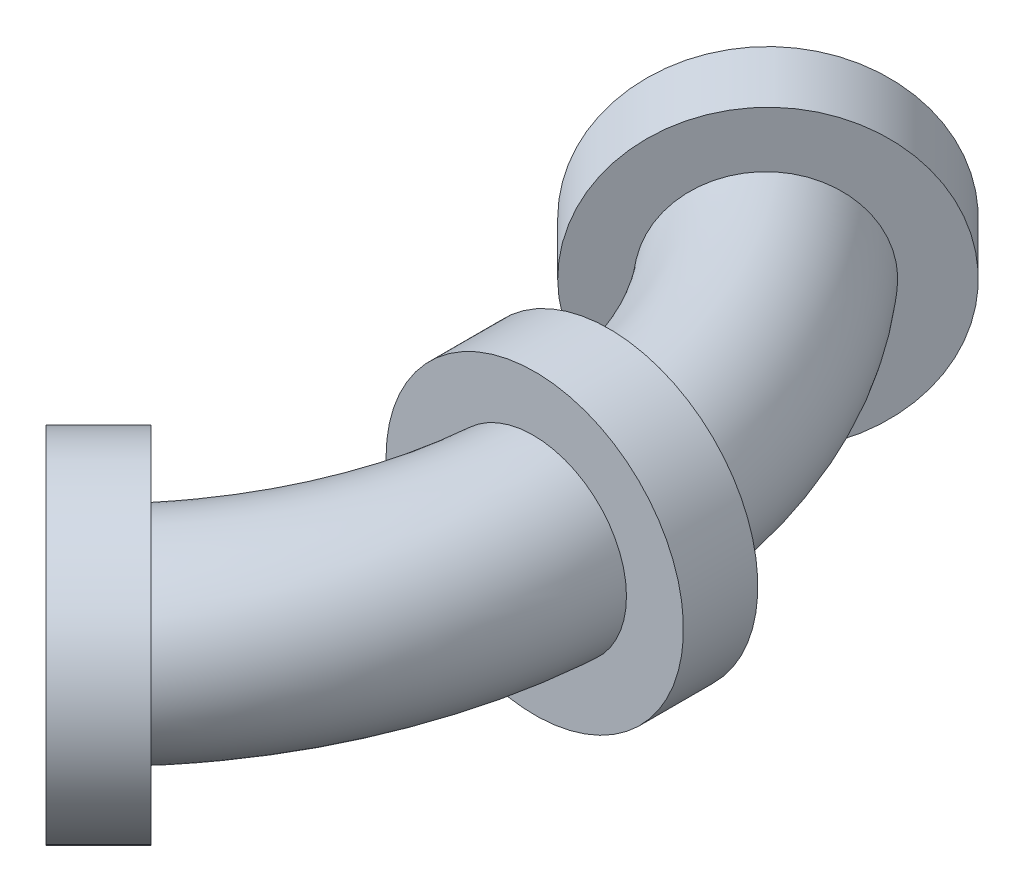
ISO-10303-21;
HEADER;
FILE_DESCRIPTION(('STEP AP214'),'2;1');
FILE_NAME('part.step','',(''),(''),'','','');
FILE_SCHEMA(('AUTOMOTIVE_DESIGN { 1 0 10303 214 1 1 1 1 }'));
ENDSEC;
DATA;
#1=APPLICATION_CONTEXT('core data for automotive mechanical design processes');
#2=APPLICATION_PROTOCOL_DEFINITION('international standard','automotive_design',2000,#1);
#3=PRODUCT_CONTEXT('',#1,'mechanical');
#4=PRODUCT('Part','Part','',(#3));
#5=PRODUCT_RELATED_PRODUCT_CATEGORY('part','',(#4));
#6=PRODUCT_DEFINITION_FORMATION('','',#4);
#7=PRODUCT_DEFINITION_CONTEXT('part definition',#1,'design');
#8=PRODUCT_DEFINITION('design','',#6,#7);
#9=PRODUCT_DEFINITION_SHAPE('','',#8);
#10=(LENGTH_UNIT() NAMED_UNIT(*) SI_UNIT(.MILLI.,.METRE.));
#11=(NAMED_UNIT(*) PLANE_ANGLE_UNIT() SI_UNIT($,.RADIAN.));
#12=(NAMED_UNIT(*) SI_UNIT($,.STERADIAN.) SOLID_ANGLE_UNIT());
#13=UNCERTAINTY_MEASURE_WITH_UNIT(LENGTH_MEASURE(1.E-05),#10,'distance_accuracy_value','');
#14=(GEOMETRIC_REPRESENTATION_CONTEXT(3) GLOBAL_UNCERTAINTY_ASSIGNED_CONTEXT((#13)) GLOBAL_UNIT_ASSIGNED_CONTEXT((#10,
#11,#12)) REPRESENTATION_CONTEXT('',''));
#15=CARTESIAN_POINT('',(0.,0.,0.));
#16=DIRECTION('',(0.,0.,1.));
#17=DIRECTION('',(1.,0.,0.));
#18=AXIS2_PLACEMENT_3D('',#15,#16,#17);
#19=CARTESIAN_POINT('',(-12.7323954473516,0.,10.));
#20=DIRECTION('',(0.,-1.,0.));
#21=DIRECTION('',(1.,0.,0.));
#22=AXIS2_PLACEMENT_3D('',#19,#20,#21);
#23=TOROIDAL_SURFACE('',#22,12.7323954473516,2.5);
#24=CARTESIAN_POINT('',(-2.50078018704879,-0.4873989422748,9.));
#25=CARTESIAN_POINT('',(-2.47330937193923,-0.624912358225868,9.));
#26=CARTESIAN_POINT('',(-2.43417264690654,-0.760201090458412,9.));
#27=CARTESIAN_POINT('',(-2.33367871934493,-1.02238634078513,9.));
#28=CARTESIAN_POINT('',(-2.2722941862731,-1.1492723086803,9.));
#29=CARTESIAN_POINT('',(-2.12914333287143,-1.39087420533817,9.));
#30=CARTESIAN_POINT('',(-2.04739025473223,-1.50559797229687,9.));
#31=CARTESIAN_POINT('',(-1.8658619494132,-1.71971300562462,9.));
#32=CARTESIAN_POINT('',(-1.76609105450976,-1.8191079470903,9.));
#33=CARTESIAN_POINT('',(-1.55101361371615,-2.00012851479686,9.));
#34=CARTESIAN_POINT('',(-1.43565896533594,-2.08169698994784,9.));
#35=CARTESIAN_POINT('',(-1.19292799193179,-2.2243957357031,9.));
#36=CARTESIAN_POINT('',(-1.06555095860832,-2.28552480115337,9.));
#37=CARTESIAN_POINT('',(-0.801899123227711,-2.38581963503019,9.));
#38=CARTESIAN_POINT('',(-0.66559399394305,-2.42490569473886,9.));
#39=CARTESIAN_POINT('',(-0.388359824897333,-2.47967429531579,9.));
#40=CARTESIAN_POINT('',(-0.247430746380716,-2.49535663997492,9.));
#41=CARTESIAN_POINT('',(0.0352526610412137,-2.50287143075767,9.));
#42=CARTESIAN_POINT('',(0.177007843332606,-2.49467185766468,9.));
#43=CARTESIAN_POINT('',(0.45712500975892,-2.45456782755884,9.));
#44=CARTESIAN_POINT('',(0.59548700897409,-2.42266347591635,9.));
#45=CARTESIAN_POINT('',(0.864746352474126,-2.3360738876806,9.));
#46=CARTESIAN_POINT('',(0.99565059508096,-2.28141010536683,9.));
#47=CARTESIAN_POINT('',(1.24639412580068,-2.15083287892071,9.));
#48=CARTESIAN_POINT('',(1.36623352012165,-2.0749196387836,9.));
#49=CARTESIAN_POINT('',(1.59115374596313,-1.90417910892377,9.));
#50=CARTESIAN_POINT('',(1.69626731205889,-1.80939494227812,9.));
#51=CARTESIAN_POINT('',(1.88904024052652,-1.60348541865218,9.));
#52=CARTESIAN_POINT('',(1.97669984205491,-1.49236028561424,9.));
#53=CARTESIAN_POINT('',(2.13184723875049,-1.25722189312339,9.));
#54=CARTESIAN_POINT('',(2.19938476754571,-1.13324144769051,9.));
#55=CARTESIAN_POINT('',(2.31264028858992,-0.875685714633746,9.));
#56=CARTESIAN_POINT('',(2.35835852631226,-0.742110534972864,9.));
#57=CARTESIAN_POINT('',(2.42659297364527,-0.469434386494024,9.));
#58=CARTESIAN_POINT('',(2.44915374989143,-0.330344568726083,9.));
#59=CARTESIAN_POINT('',(2.47058036021977,-0.0503519863951842,9.));
#60=CARTESIAN_POINT('',(2.46944635473798,0.0905507658860407,9.));
#61=CARTESIAN_POINT('',(2.44352817682635,0.370034065064628,9.));
#62=CARTESIAN_POINT('',(2.41876550092664,0.508616606211019,9.));
#63=CARTESIAN_POINT('',(2.34633179240015,0.77965897601376,9.));
#64=CARTESIAN_POINT('',(2.2986607759541,0.912118808994661,9.));
#65=CARTESIAN_POINT('',(2.18175903946849,1.16720105250362,9.));
#66=CARTESIAN_POINT('',(2.11252216393523,1.28982064177056,9.));
#67=CARTESIAN_POINT('',(1.95447270511947,1.52171693306445,9.));
#68=CARTESIAN_POINT('',(1.86566001773156,1.63099356412792,9.));
#69=CARTESIAN_POINT('',(1.67085085511078,1.83327435307106,9.));
#70=CARTESIAN_POINT('',(1.56483008126404,1.92625510855252,9.));
#71=CARTESIAN_POINT('',(1.33871334437629,2.09314518077714,9.));
#72=CARTESIAN_POINT('',(1.2186172229183,2.1670542828403,9.));
#73=CARTESIAN_POINT('',(0.96746977482493,2.29388474218228,9.));
#74=CARTESIAN_POINT('',(0.836394246120855,2.34675817352724,9.));
#75=CARTESIAN_POINT('',(0.567240862074713,2.42981040168131,9.));
#76=CARTESIAN_POINT('',(0.429162916191717,2.45998890496615,9.));
#77=CARTESIAN_POINT('',(0.149554752022131,2.49687016280116,9.));
#78=CARTESIAN_POINT('',(0.00801676124242382,2.50351399830464,9.));
#79=CARTESIAN_POINT('',(-0.274172045495107,2.49299122639192,9.));
#80=CARTESIAN_POINT('',(-0.414822848383973,2.47582426904352,9.));
#81=CARTESIAN_POINT('',(-0.691510001668644,2.41811881817426,9.));
#82=CARTESIAN_POINT('',(-0.827537622867498,2.37753845959396,9.));
#83=CARTESIAN_POINT('',(-1.09085131446959,2.2741171956576,9.));
#84=CARTESIAN_POINT('',(-1.21813732753696,2.21127614431117,9.));
#85=CARTESIAN_POINT('',(-1.46034047419496,2.06509741438065,9.));
#86=CARTESIAN_POINT('',(-1.57525763937611,1.9817597881474,9.));
#87=CARTESIAN_POINT('',(-1.78942208970697,1.79693322440889,9.));
#88=CARTESIAN_POINT('',(-1.888670151002,1.69544518648822,9.));
#89=CARTESIAN_POINT('',(-2.06839500702632,1.47746754095168,9.));
#90=CARTESIAN_POINT('',(-2.14891990151106,1.36101759402566,9.));
#91=CARTESIAN_POINT('',(-2.28919971195099,1.11617244435617,9.));
#92=CARTESIAN_POINT('',(-2.34894992852866,0.987774547218482,9.));
#93=CARTESIAN_POINT('',(-2.44571444888519,0.72323622385785,9.));
#94=CARTESIAN_POINT('',(-2.4828125768562,0.587126405323094,9.));
#95=CARTESIAN_POINT('',(-2.53348901423679,0.3107145481104,9.));
#96=CARTESIAN_POINT('',(-2.54709641041645,0.170417913053504,9.));
#97=CARTESIAN_POINT('',(-2.5498533007339,-0.056713805457364,9.));
#98=CARTESIAN_POINT('',(-2.54635326545976,-0.143524499586232,9.));
#99=CARTESIAN_POINT('',(-2.53031879670745,-0.316307237780159,9.));
#100=CARTESIAN_POINT('',(-2.51778439251502,-0.402279284562856,9.));
#101=CARTESIAN_POINT('',(-2.50078018704879,-0.4873989422748,9.));
#102=B_SPLINE_CURVE_WITH_KNOTS('',3,(#24,#25,#26,#27,#28,#29,#30,#31,#32,#33,#34,#35,#36,#37,
#38,#39,#40,#41,#42,#43,#44,#45,#46,#47,#48,#49,#50,#51,#52,#53,#54,#55,#56,#57,#58,#59,#60,#61,
#62,#63,#64,#65,#66,#67,#68,#69,#70,#71,#72,#73,#74,#75,#76,#77,#78,#79,#80,#81,#82,#83,#84,#85,
#86,#87,#88,#89,#90,#91,#92,#93,#94,#95,#96,#97,#98,#99,#100,#101),.UNSPECIFIED.,.T.,.F.,(4,2,2,
2,2,2,2,2,2,2,2,2,2,2,2,2,2,2,2,2,2,2,2,2,2,2,2,2,2,2,2,2,2,2,2,2,2,2,4),(0.,0.420373062682159,
0.841264297016847,1.26188260835425,1.68239991886008,2.10424623631204,2.52611742239676,
2.9495044940372,3.37289511519697,3.79685365028962,4.22081030085101,4.64436820836817,
5.06792204985995,5.49051888862235,5.91310993650877,6.33464767640356,6.75618067376468,
7.17690089933375,7.59761827623092,8.01795326387647,8.43828795462931,8.85874273065982,
9.27919974274912,9.70025570893456,10.1213164145284,10.5433310106452,10.9653510647832,
11.3884269024563,11.8115089578742,12.2353498732011,12.6591935682189,13.083036180698,
13.5068577921841,13.9295782712449,14.3523943105196,14.7736360810535,15.1943558851164,
15.454564148797,15.714771568992),.UNSPECIFIED.);
#103=CARTESIAN_POINT('',(-2.50078018704879,-0.4873989422748,9.));
#104=VERTEX_POINT('',#103);
#105=EDGE_CURVE('E12',#104,#104,#102,.T.);
#106=ORIENTED_EDGE('',*,*,#105,.F.);
#107=EDGE_LOOP('',(#106));
#108=FACE_BOUND('',#107,.T.);
#109=CARTESIAN_POINT('',(-3.02222086640258,-2.49969460885975,1.70403898142404));
#110=CARTESIAN_POINT('',(-2.92247659212123,-2.49749016271349,1.6042947071427));
#111=CARTESIAN_POINT('',(-2.82279163529835,-2.48339006185972,1.50460975031981));
#112=CARTESIAN_POINT('',(-2.62642496300902,-2.43172275397527,1.30824307803048));
#113=CARTESIAN_POINT('',(-2.52974696041497,-2.39412765659393,1.21156507543643));
#114=CARTESIAN_POINT('',(-2.34225850339972,-2.29651183023151,1.02407661842118));
#115=CARTESIAN_POINT('',(-2.25144581833784,-2.23649968629157,0.933263933359305));
#116=CARTESIAN_POINT('',(-2.07827595523629,-2.09574407103684,0.760094070257746));
#117=CARTESIAN_POINT('',(-1.995916651921,-2.01500582845659,0.677734766942461));
#118=CARTESIAN_POINT('',(-1.84211114930533,-1.83521537520369,0.523929264326792));
#119=CARTESIAN_POINT('',(-1.77064744200134,-1.73619312342705,0.452465557022802));
#120=CARTESIAN_POINT('',(-1.64052252305054,-1.52254594377793,0.322340638071994));
#121=CARTESIAN_POINT('',(-1.58186165163579,-1.40792060138873,0.263679766657247));
#122=CARTESIAN_POINT('',(-1.47916249329064,-1.16663041509567,0.160980608312094));
#123=CARTESIAN_POINT('',(-1.43508834535197,-1.03999609701205,0.116906460373427));
#124=CARTESIAN_POINT('',(-1.36263033735156,-0.778047559370206,0.0444484523730171));
#125=CARTESIAN_POINT('',(-1.3342462708269,-0.642733454053867,0.016064385848354));
#126=CARTESIAN_POINT('',(-1.29402215144788,-0.367531017323259,-0.024159733530665));
#127=CARTESIAN_POINT('',(-1.28215209206299,-0.227651456270286,-0.0360297929155509));
#128=CARTESIAN_POINT('',(-1.27520011546386,0.0529389557891001,-0.042981769514679));
#129=CARTESIAN_POINT('',(-1.2801180678942,0.193649800332301,-0.038063817084345));
#130=CARTESIAN_POINT('',(-1.30659030613128,0.471795345564311,-0.0115915788472607));
#131=CARTESIAN_POINT('',(-1.32813183208945,0.609232475704555,0.00994994711090805));
#132=CARTESIAN_POINT('',(-1.3872179917327,0.87704480719826,0.0690361067541516));
#133=CARTESIAN_POINT('',(-1.42476264216224,1.00742000116248,0.106580757183699));
#134=CARTESIAN_POINT('',(-1.51479983561976,1.25747287633282,0.196617950641222));
#135=CARTESIAN_POINT('',(-1.56729883359824,1.37714590864431,0.249116948619702));
#136=CARTESIAN_POINT('',(-1.68573784812752,1.60235331357806,0.367555963148978));
#137=CARTESIAN_POINT('',(-1.75167794236055,1.70788760448025,0.433496057382012));
#138=CARTESIAN_POINT('',(-1.89523265017759,1.90200243906206,0.577050765199052));
#139=CARTESIAN_POINT('',(-1.97286519160523,1.99055646480869,0.654683306626689));
#140=CARTESIAN_POINT('',(-2.13752039232321,2.14802602773573,0.819338507344674));
#141=CARTESIAN_POINT('',(-2.2245431597441,2.2169413387387,0.906361274765562));
#142=CARTESIAN_POINT('',(-2.40572471879293,2.33335114008751,1.08754283381439));
#143=CARTESIAN_POINT('',(-2.49989968779043,2.38079527190095,1.1817178028119));
#144=CARTESIAN_POINT('',(-2.6925373619,2.45271204116219,1.37435547692146));
#145=CARTESIAN_POINT('',(-2.79100012748821,2.4771843544999,1.47281824250967));
#146=CARTESIAN_POINT('',(-2.9896786092571,2.50252099310672,1.67149672427856));
#147=CARTESIAN_POINT('',(-3.0898980578948,2.50332679399382,1.77171617291627));
#148=CARTESIAN_POINT('',(-3.2890154051166,2.48117403015145,1.97083352013807));
#149=CARTESIAN_POINT('',(-3.38791328745179,2.45821517350286,2.06973140247325));
#150=CARTESIAN_POINT('',(-3.58174902669631,2.38912827439308,2.26356714171777));
#151=CARTESIAN_POINT('',(-3.67668015910431,2.34296248995967,2.35849827412577));
#152=CARTESIAN_POINT('',(-3.85971339306079,2.22874125013059,2.54153150808225));
#153=CARTESIAN_POINT('',(-3.94781547366068,2.16068572758993,2.62963358868215));
#154=CARTESIAN_POINT('',(-4.11465061927927,2.00461945156557,2.79646873430074));
#155=CARTESIAN_POINT('',(-4.19338656256149,1.91661485281951,2.87520467758296));
#156=CARTESIAN_POINT('',(-4.33925800197316,1.72311337392988,3.02107611699463));
#157=CARTESIAN_POINT('',(-4.40639363741639,1.61761670388698,3.08821175243786));
#158=CARTESIAN_POINT('',(-4.52694867569312,1.39242880581949,3.20876679071459));
#159=CARTESIAN_POINT('',(-4.58040569294385,1.27277785635903,3.26222380796532));
#160=CARTESIAN_POINT('',(-4.6722858894587,1.0224399984562,3.35410400448017));
#161=CARTESIAN_POINT('',(-4.71070946626969,0.891753381954041,3.39252758129116));
#162=CARTESIAN_POINT('',(-4.77126064052525,0.623651983919618,3.45307875554672));
#163=CARTESIAN_POINT('',(-4.79345714135554,0.486268324335732,3.47527525637701));
#164=CARTESIAN_POINT('',(-4.82116728114452,0.208176905695609,3.50298539616599));
#165=CARTESIAN_POINT('',(-4.82668125902515,0.0674692142288943,3.50849937404662));
#166=CARTESIAN_POINT('',(-4.8208732641735,-0.212796868364323,3.50269137919497));
#167=CARTESIAN_POINT('',(-4.8096050772469,-0.352357495919339,3.49142319226837));
#168=CARTESIAN_POINT('',(-4.77066293432808,-0.626822141842174,3.45248104934955));
#169=CARTESIAN_POINT('',(-4.74298898630043,-0.761726162470626,3.4248071013219));
#170=CARTESIAN_POINT('',(-4.67203713922213,-1.02309112436274,3.3538552542436));
#171=CARTESIAN_POINT('',(-4.62875597075666,-1.14955029000721,3.31057408577813));
#172=CARTESIAN_POINT('',(-4.52784641997835,-1.39044090433111,3.20966453499982));
#173=CARTESIAN_POINT('',(-4.4702183612094,-1.50487262416474,3.15203647623087));
#174=CARTESIAN_POINT('',(-4.34205352185892,-1.71888024505196,3.02387163688039));
#175=CARTESIAN_POINT('',(-4.27147459794315,-1.81840566123345,2.95329271296461));
#176=CARTESIAN_POINT('',(-4.11952684495637,-1.9993982075061,2.80134495997784));
#177=CARTESIAN_POINT('',(-4.03815510531766,-2.08086045049677,2.71997322033913));
#178=CARTESIAN_POINT('',(-3.86654691599045,-2.22376866008717,2.54836503101192));
#179=CARTESIAN_POINT('',(-3.77627070824423,-2.28511902921713,2.45808882326569));
#180=CARTESIAN_POINT('',(-3.58979992071265,-2.38550804696209,2.27161803573412));
#181=CARTESIAN_POINT('',(-3.49361244535189,-2.42457292006894,2.17543056037335));
#182=CARTESIAN_POINT('',(-3.33439771728984,-2.46921331701607,2.0162158323113));
#183=CARTESIAN_POINT('',(-3.27231460103509,-2.4818373125269,1.95413271605656));
#184=CARTESIAN_POINT('',(-3.1475534777445,-2.49777033220605,1.82937159276596));
#185=CARTESIAN_POINT('',(-3.0848754694683,-2.50107933694834,1.76669358448976));
#186=CARTESIAN_POINT('',(-3.02222086640258,-2.49969460885975,1.70403898142404));
#187=B_SPLINE_CURVE_WITH_KNOTS('',3,(#109,#110,#111,#112,#113,#114,#115,#116,#117,#118,#119,
#120,#121,#122,#123,#124,#125,#126,#127,#128,#129,#130,#131,#132,#133,#134,#135,#136,#137,#138,
#139,#140,#141,#142,#143,#144,#145,#146,#147,#148,#149,#150,#151,#152,#153,#154,#155,#156,#157,
#158,#159,#160,#161,#162,#163,#164,#165,#166,#167,#168,#169,#170,#171,#172,#173,#174,#175,#176,
#177,#178,#179,#180,#181,#182,#183,#184,#185,#186),.UNSPECIFIED.,.T.,.F.,(4,2,2,2,2,2,2,2,2,2,2,
2,2,2,2,2,2,2,2,2,2,2,2,2,2,2,2,2,2,2,2,2,2,2,2,2,2,2,4),(0.,0.422908212872228,
0.846319406091756,1.26956861178242,1.69271114584979,2.11516640362451,2.53763288667246,
2.95905289719163,3.38046736218971,3.801115097778,4.22175956713145,4.64208148083465,
5.06240383433236,5.48290789298627,5.90341438199423,6.3245723173028,6.74573510285631,
7.16788062892606,7.59003211097055,8.01322743417885,8.43642795587426,8.86031897608294,
9.28421129655536,9.70797301430358,10.1317296425361,10.5543081593265,10.9768755006228,
11.3976379467348,11.8183918445847,12.237800150728,12.6572082532592,13.0767042648706,
13.4961908170745,13.9170674384044,14.3380577918778,14.7610211574097,15.1834857679851,
15.4491360135066,15.7147868130302),.UNSPECIFIED.);
#188=CARTESIAN_POINT('',(-3.02222086640258,-2.49969460885975,1.70403898142404));
#189=VERTEX_POINT('',#188);
#190=EDGE_CURVE('E102',#189,#189,#187,.T.);
#191=ORIENTED_EDGE('',*,*,#190,.T.);
#192=EDGE_LOOP('',(#191));
#193=FACE_BOUND('',#192,.T.);
#194=ADVANCED_FACE('F71',(#108,#193),#23,.T.);
#195=CARTESIAN_POINT('',(-4.43633906696712,0.,0.289730057242397));
#196=DIRECTION('',(0.707106781186549,0.,0.707106781186546));
#197=DIRECTION('',(0.707106781186546,0.,-0.707106781186549));
#198=AXIS2_PLACEMENT_3D('',#195,#196,#197);
#199=CYLINDRICAL_SURFACE('',#198,4.);
#200=CARTESIAN_POINT('',(-4.43633906696712,0.,0.289730057242397));
#201=DIRECTION('',(-0.707106781186549,0.,-0.707106781186546));
#202=DIRECTION('',(-0.707106781186546,0.,0.707106781186549));
#203=AXIS2_PLACEMENT_3D('',#200,#201,#202);
#204=CIRCLE('',#203,4.);
#205=CARTESIAN_POINT('',(-7.26476619171331,0.,3.11815718198859));
#206=VERTEX_POINT('',#205);
#207=EDGE_CURVE('E148',#206,#206,#204,.T.);
#208=ORIENTED_EDGE('',*,*,#207,.F.);
#209=EDGE_LOOP('',(#208));
#210=FACE_BOUND('',#209,.T.);
#211=CARTESIAN_POINT('',(-3.02212550459403,0.,1.70394361961549));
#212=DIRECTION('',(-0.707106781186549,0.,-0.707106781186546));
#213=DIRECTION('',(-0.707106781186546,0.,0.707106781186549));
#214=AXIS2_PLACEMENT_3D('',#211,#212,#213);
#215=CIRCLE('',#214,4.);
#216=CARTESIAN_POINT('',(-5.85055262934021,0.,4.53237074436169));
#217=VERTEX_POINT('',#216);
#218=EDGE_CURVE('E143',#217,#217,#215,.T.);
#219=ORIENTED_EDGE('',*,*,#218,.T.);
#220=EDGE_LOOP('',(#219));
#221=FACE_BOUND('',#220,.T.);
#222=ADVANCED_FACE('F126',(#210,#221),#199,.T.);
#223=CARTESIAN_POINT('',(-4.43633906696712,0.,0.289730057242397));
#224=DIRECTION('',(-0.707106781186549,0.,-0.707106781186546));
#225=DIRECTION('',(-0.707106781186546,0.,0.707106781186549));
#226=AXIS2_PLACEMENT_3D('',#223,#224,#225);
#227=PLANE('',#226);
#228=ORIENTED_EDGE('',*,*,#207,.T.);
#229=EDGE_LOOP('',(#228));
#230=FACE_BOUND('',#229,.T.);
#231=ADVANCED_FACE('F132',(#230),#227,.T.);
#232=CARTESIAN_POINT('',(-3.02212550459403,0.,1.70394361961549));
#233=DIRECTION('',(-0.707106781186549,0.,-0.707106781186546));
#234=DIRECTION('',(-0.707106781186546,0.,0.707106781186549));
#235=AXIS2_PLACEMENT_3D('',#232,#233,#234);
#236=PLANE('',#235);
#237=ORIENTED_EDGE('',*,*,#190,.F.);
#238=EDGE_LOOP('',(#237));
#239=FACE_BOUND('',#238,.T.);
#240=ORIENTED_EDGE('',*,*,#218,.F.);
#241=EDGE_LOOP('',(#240));
#242=FACE_BOUND('',#241,.T.);
#243=ADVANCED_FACE('F165',(#239,#242),#236,.F.);
#244=CARTESIAN_POINT('',(0.,0.,9.));
#245=DIRECTION('',(0.,0.,1.));
#246=DIRECTION('',(1.,0.,0.));
#247=AXIS2_PLACEMENT_3D('',#244,#245,#246);
#248=CYLINDRICAL_SURFACE('',#247,4.);
#249=CARTESIAN_POINT('',(0.,0.,9.));
#250=DIRECTION('',(0.,0.,-1.));
#251=DIRECTION('',(-1.,0.,0.));
#252=AXIS2_PLACEMENT_3D('',#249,#250,#251);
#253=CIRCLE('',#252,4.);
#254=CARTESIAN_POINT('',(-4.,0.,9.00000000000001));
#255=VERTEX_POINT('',#254);
#256=EDGE_CURVE('E144',#255,#255,#253,.T.);
#257=ORIENTED_EDGE('',*,*,#256,.F.);
#258=EDGE_LOOP('',(#257));
#259=FACE_BOUND('',#258,.T.);
#260=CARTESIAN_POINT('',(0.,0.,11.));
#261=DIRECTION('',(0.,0.,-1.));
#262=DIRECTION('',(-1.,0.,0.));
#263=AXIS2_PLACEMENT_3D('',#260,#261,#262);
#264=CIRCLE('',#263,4.);
#265=CARTESIAN_POINT('',(-4.,0.,11.));
#266=VERTEX_POINT('',#265);
#267=EDGE_CURVE('E151',#266,#266,#264,.T.);
#268=ORIENTED_EDGE('',*,*,#267,.T.);
#269=EDGE_LOOP('',(#268));
#270=FACE_BOUND('',#269,.T.);
#271=ADVANCED_FACE('F162',(#259,#270),#248,.T.);
#272=CARTESIAN_POINT('',(0.,0.,9.));
#273=DIRECTION('',(0.,0.,-1.));
#274=DIRECTION('',(-1.,0.,0.));
#275=AXIS2_PLACEMENT_3D('',#272,#273,#274);
#276=PLANE('',#275);
#277=ORIENTED_EDGE('',*,*,#105,.T.);
#278=EDGE_LOOP('',(#277));
#279=FACE_BOUND('',#278,.T.);
#280=ORIENTED_EDGE('',*,*,#256,.T.);
#281=EDGE_LOOP('',(#280));
#282=FACE_BOUND('',#281,.T.);
#283=ADVANCED_FACE('F160',(#279,#282),#276,.T.);
#284=CARTESIAN_POINT('',(0.,0.,11.));
#285=DIRECTION('',(0.,0.,-1.));
#286=DIRECTION('',(-1.,0.,0.));
#287=AXIS2_PLACEMENT_3D('',#284,#285,#286);
#288=PLANE('',#287);
#289=CARTESIAN_POINT('',(-2.50078018704879,-0.4873989422748,11.));
#290=CARTESIAN_POINT('',(-2.47330937193923,-0.624912358225869,11.));
#291=CARTESIAN_POINT('',(-2.43417264690654,-0.760201090458412,11.));
#292=CARTESIAN_POINT('',(-2.33367871934493,-1.02238634078513,11.));
#293=CARTESIAN_POINT('',(-2.2722941862731,-1.1492723086803,11.));
#294=CARTESIAN_POINT('',(-2.12914333287143,-1.39087420533817,11.));
#295=CARTESIAN_POINT('',(-2.04739025473223,-1.50559797229687,11.));
#296=CARTESIAN_POINT('',(-1.8658619494132,-1.71971300562462,11.));
#297=CARTESIAN_POINT('',(-1.76609105450976,-1.8191079470903,11.));
#298=CARTESIAN_POINT('',(-1.55101361371614,-2.00012851479686,11.));
#299=CARTESIAN_POINT('',(-1.43565896533594,-2.08169698994784,11.));
#300=CARTESIAN_POINT('',(-1.19292799193179,-2.22439573570311,11.));
#301=CARTESIAN_POINT('',(-1.06555095860832,-2.28552480115337,11.));
#302=CARTESIAN_POINT('',(-0.801899123227711,-2.38581963503019,11.));
#303=CARTESIAN_POINT('',(-0.66559399394305,-2.42490569473886,11.));
#304=CARTESIAN_POINT('',(-0.388359824897333,-2.47967429531579,11.));
#305=CARTESIAN_POINT('',(-0.247430746380715,-2.49535663997492,11.));
#306=CARTESIAN_POINT('',(0.0352526610412147,-2.50287143075767,11.));
#307=CARTESIAN_POINT('',(0.177007843332607,-2.49467185766468,11.));
#308=CARTESIAN_POINT('',(0.457125009758921,-2.45456782755884,11.));
#309=CARTESIAN_POINT('',(0.595487008974092,-2.42266347591635,11.));
#310=CARTESIAN_POINT('',(0.864746352474127,-2.3360738876806,11.));
#311=CARTESIAN_POINT('',(0.995650595080961,-2.28141010536683,11.));
#312=CARTESIAN_POINT('',(1.24639412580068,-2.15083287892071,11.));
#313=CARTESIAN_POINT('',(1.36623352012165,-2.0749196387836,11.));
#314=CARTESIAN_POINT('',(1.59115374596313,-1.90417910892377,11.));
#315=CARTESIAN_POINT('',(1.69626731205889,-1.80939494227812,11.));
#316=CARTESIAN_POINT('',(1.88904024052652,-1.60348541865218,11.));
#317=CARTESIAN_POINT('',(1.97669984205491,-1.49236028561424,11.));
#318=CARTESIAN_POINT('',(2.13184723875049,-1.25722189312339,11.));
#319=CARTESIAN_POINT('',(2.19938476754571,-1.13324144769051,11.));
#320=CARTESIAN_POINT('',(2.31264028858992,-0.875685714633745,11.));
#321=CARTESIAN_POINT('',(2.35835852631226,-0.742110534972863,11.));
#322=CARTESIAN_POINT('',(2.42659297364527,-0.469434386494023,11.));
#323=CARTESIAN_POINT('',(2.44915374989143,-0.330344568726082,11.));
#324=CARTESIAN_POINT('',(2.47058036021977,-0.0503519863951833,11.));
#325=CARTESIAN_POINT('',(2.46944635473798,0.0905507658860417,11.));
#326=CARTESIAN_POINT('',(2.44352817682635,0.370034065064629,11.));
#327=CARTESIAN_POINT('',(2.41876550092664,0.50861660621102,11.));
#328=CARTESIAN_POINT('',(2.34633179240015,0.779658976013761,11.));
#329=CARTESIAN_POINT('',(2.2986607759541,0.912118808994662,11.));
#330=CARTESIAN_POINT('',(2.18175903946849,1.16720105250362,11.));
#331=CARTESIAN_POINT('',(2.11252216393523,1.28982064177056,11.));
#332=CARTESIAN_POINT('',(1.95447270511947,1.52171693306445,11.));
#333=CARTESIAN_POINT('',(1.86566001773156,1.63099356412792,11.));
#334=CARTESIAN_POINT('',(1.67085085511078,1.83327435307106,11.));
#335=CARTESIAN_POINT('',(1.56483008126404,1.92625510855252,11.));
#336=CARTESIAN_POINT('',(1.33871334437629,2.09314518077714,11.));
#337=CARTESIAN_POINT('',(1.2186172229183,2.1670542828403,11.));
#338=CARTESIAN_POINT('',(0.967469774824929,2.29388474218228,11.));
#339=CARTESIAN_POINT('',(0.836394246120853,2.34675817352724,11.));
#340=CARTESIAN_POINT('',(0.567240862074711,2.42981040168132,11.));
#341=CARTESIAN_POINT('',(0.429162916191716,2.45998890496615,11.));
#342=CARTESIAN_POINT('',(0.14955475202213,2.49687016280116,11.));
#343=CARTESIAN_POINT('',(0.00801676124242252,2.50351399830464,11.));
#344=CARTESIAN_POINT('',(-0.274172045495109,2.49299122639192,11.));
#345=CARTESIAN_POINT('',(-0.414822848383974,2.47582426904352,11.));
#346=CARTESIAN_POINT('',(-0.691510001668645,2.41811881817426,11.));
#347=CARTESIAN_POINT('',(-0.827537622867499,2.37753845959395,11.));
#348=CARTESIAN_POINT('',(-1.09085131446959,2.2741171956576,11.));
#349=CARTESIAN_POINT('',(-1.21813732753696,2.21127614431117,11.));
#350=CARTESIAN_POINT('',(-1.46034047419496,2.06509741438065,11.));
#351=CARTESIAN_POINT('',(-1.57525763937611,1.98175978814739,11.));
#352=CARTESIAN_POINT('',(-1.78942208970697,1.79693322440889,11.));
#353=CARTESIAN_POINT('',(-1.888670151002,1.69544518648822,11.));
#354=CARTESIAN_POINT('',(-2.06839500702633,1.47746754095168,11.));
#355=CARTESIAN_POINT('',(-2.14891990151106,1.36101759402566,11.));
#356=CARTESIAN_POINT('',(-2.28919971195099,1.11617244435617,11.));
#357=CARTESIAN_POINT('',(-2.34894992852866,0.987774547218481,11.));
#358=CARTESIAN_POINT('',(-2.44571444888519,0.72323622385785,11.));
#359=CARTESIAN_POINT('',(-2.4828125768562,0.587126405323094,11.));
#360=CARTESIAN_POINT('',(-2.53348901423679,0.310714548110399,11.));
#361=CARTESIAN_POINT('',(-2.54709641041645,0.170417913053503,11.));
#362=CARTESIAN_POINT('',(-2.5498533007339,-0.0567138054573654,11.));
#363=CARTESIAN_POINT('',(-2.54635326545976,-0.143524499586233,11.));
#364=CARTESIAN_POINT('',(-2.53031879670745,-0.316307237780159,11.));
#365=CARTESIAN_POINT('',(-2.51778439251502,-0.402279284562856,11.));
#366=CARTESIAN_POINT('',(-2.50078018704879,-0.4873989422748,11.));
#367=B_SPLINE_CURVE_WITH_KNOTS('',3,(#289,#290,#291,#292,#293,#294,#295,#296,#297,#298,#299,
#300,#301,#302,#303,#304,#305,#306,#307,#308,#309,#310,#311,#312,#313,#314,#315,#316,#317,#318,
#319,#320,#321,#322,#323,#324,#325,#326,#327,#328,#329,#330,#331,#332,#333,#334,#335,#336,#337,
#338,#339,#340,#341,#342,#343,#344,#345,#346,#347,#348,#349,#350,#351,#352,#353,#354,#355,#356,
#357,#358,#359,#360,#361,#362,#363,#364,#365,#366),.UNSPECIFIED.,.T.,.F.,(4,2,2,2,2,2,2,2,2,2,2,
2,2,2,2,2,2,2,2,2,2,2,2,2,2,2,2,2,2,2,2,2,2,2,2,2,2,2,4),(0.,0.420373062682159,
0.841264297016847,1.26188260835425,1.68239991886009,2.10424623631204,2.52611742239676,
2.9495044940372,3.37289511519697,3.79685365028962,4.22081030085101,4.64436820836817,
5.06792204985995,5.49051888862235,5.91310993650877,6.33464767640356,6.75618067376468,
7.17690089933375,7.59761827623092,8.01795326387647,8.43828795462932,8.85874273065982,
9.27919974274912,9.70025570893456,10.1213164145284,10.5433310106452,10.9653510647832,
11.3884269024563,11.8115089578742,12.2353498732011,12.6591935682189,13.083036180698,
13.5068577921841,13.9295782712449,14.3523943105196,14.7736360810535,15.1943558851164,
15.454564148797,15.714771568992),.UNSPECIFIED.);
#368=CARTESIAN_POINT('',(-2.50078018704879,-0.4873989422748,11.));
#369=VERTEX_POINT('',#368);
#370=EDGE_CURVE('E140',#369,#369,#367,.T.);
#371=ORIENTED_EDGE('',*,*,#370,.F.);
#372=EDGE_LOOP('',(#371));
#373=FACE_BOUND('',#372,.T.);
#374=ORIENTED_EDGE('',*,*,#267,.F.);
#375=EDGE_LOOP('',(#374));
#376=FACE_BOUND('',#375,.T.);
#377=ADVANCED_FACE('F121',(#373,#376),#288,.F.);
#378=CARTESIAN_POINT('',(-4.43633906696712,0.,19.7102699427576));
#379=DIRECTION('',(-0.707106781186549,0.,0.707106781186546));
#380=DIRECTION('',(0.707106781186546,0.,0.707106781186549));
#381=AXIS2_PLACEMENT_3D('',#378,#379,#380);
#382=PLANE('',#381);
#383=CARTESIAN_POINT('',(-4.43633906696712,0.,19.7102699427576));
#384=DIRECTION('',(-0.707106781186549,0.,0.707106781186546));
#385=DIRECTION('',(0.707106781186546,0.,0.707106781186549));
#386=AXIS2_PLACEMENT_3D('',#383,#384,#385);
#387=CIRCLE('',#386,4.);
#388=CARTESIAN_POINT('',(-1.60791194222094,0.,22.5386970675038));
#389=VERTEX_POINT('',#388);
#390=EDGE_CURVE('E88',#389,#389,#387,.T.);
#391=ORIENTED_EDGE('',*,*,#390,.T.);
#392=EDGE_LOOP('',(#391));
#393=FACE_BOUND('',#392,.T.);
#394=ADVANCED_FACE('F114',(#393),#382,.T.);
#395=CARTESIAN_POINT('',(-4.43633906696712,0.,19.7102699427576));
#396=DIRECTION('',(0.707106781186549,0.,-0.707106781186546));
#397=DIRECTION('',(-0.707106781186546,0.,-0.707106781186549));
#398=AXIS2_PLACEMENT_3D('',#395,#396,#397);
#399=CYLINDRICAL_SURFACE('',#398,4.);
#400=ORIENTED_EDGE('',*,*,#390,.F.);
#401=EDGE_LOOP('',(#400));
#402=FACE_BOUND('',#401,.T.);
#403=CARTESIAN_POINT('',(-3.02212550459403,0.,18.2960563803845));
#404=DIRECTION('',(-0.707106781186549,0.,0.707106781186546));
#405=DIRECTION('',(0.707106781186546,0.,0.707106781186549));
#406=AXIS2_PLACEMENT_3D('',#403,#404,#405);
#407=CIRCLE('',#406,4.);
#408=CARTESIAN_POINT('',(-0.193698379847841,0.,21.1244835051307));
#409=VERTEX_POINT('',#408);
#410=EDGE_CURVE('E94',#409,#409,#407,.T.);
#411=ORIENTED_EDGE('',*,*,#410,.T.);
#412=EDGE_LOOP('',(#411));
#413=FACE_BOUND('',#412,.T.);
#414=ADVANCED_FACE('F112',(#402,#413),#399,.T.);
#415=CARTESIAN_POINT('',(-3.02212550459403,0.,18.2960563803845));
#416=DIRECTION('',(-0.707106781186549,0.,0.707106781186546));
#417=DIRECTION('',(0.707106781186546,0.,0.707106781186549));
#418=AXIS2_PLACEMENT_3D('',#415,#416,#417);
#419=PLANE('',#418);
#420=CARTESIAN_POINT('',(-4.52126758665078,-1.39723762394078,16.7969142983278));
#421=CARTESIAN_POINT('',(-4.57678088683575,-1.28125781716464,16.7414009981428));
#422=CARTESIAN_POINT('',(-4.6254283261417,-1.15858526358139,16.6927535588368));
#423=CARTESIAN_POINT('',(-4.70751908169252,-0.903335902348818,16.610662803286));
#424=CARTESIAN_POINT('',(-4.74094483736331,-0.77074785981945,16.5772370476152));
#425=CARTESIAN_POINT('',(-4.79155240804374,-0.4995433218901,16.5266294769348));
#426=CARTESIAN_POINT('',(-4.80873970433248,-0.360928877235209,16.5094421806461));
#427=CARTESIAN_POINT('',(-4.82637297578877,-0.0816229852645087,16.4918089091898));
#428=CARTESIAN_POINT('',(-4.82682306158235,0.0590679435790462,16.4913588233962));
#429=CARTESIAN_POINT('',(-4.81099581507844,0.338296731338503,16.5071860699001));
#430=CARTESIAN_POINT('',(-4.79474891360426,0.476838041680204,16.5234329713743));
#431=CARTESIAN_POINT('',(-4.74604997397609,0.748105850320749,16.5721319110024));
#432=CARTESIAN_POINT('',(-4.71359731224744,0.880832124651477,16.6045845727311));
#433=CARTESIAN_POINT('',(-4.63340302435953,1.13681642803449,16.684778860619));
#434=CARTESIAN_POINT('',(-4.58565007435376,1.26006736028535,16.7325318106248));
#435=CARTESIAN_POINT('',(-4.47624237449717,1.49353843714824,16.8419395104814));
#436=CARTESIAN_POINT('',(-4.41458739320827,1.6037583647763,16.9035944917703));
#437=CARTESIAN_POINT('',(-4.27888448323647,1.80848252392051,17.0392974017421));
#438=CARTESIAN_POINT('',(-4.20479127608241,1.90292672633167,17.1133906088961));
#439=CARTESIAN_POINT('',(-4.04648423079455,2.07297011810868,17.271697654184));
#440=CARTESIAN_POINT('',(-3.96227017967544,2.14856891078456,17.3559117053031));
#441=CARTESIAN_POINT('',(-3.78573897021698,2.27909079755089,17.5324429147616));
#442=CARTESIAN_POINT('',(-3.69339008020314,2.33392806712344,17.6247918047754));
#443=CARTESIAN_POINT('',(-3.5035019203604,2.42095419813562,17.8146799646181));
#444=CARTESIAN_POINT('',(-3.40596257075992,2.4531427113809,17.9122193142186));
#445=CARTESIAN_POINT('',(-3.20822943745686,2.49400909522798,18.1099524475217));
#446=CARTESIAN_POINT('',(-3.10803024649406,2.50263466542296,18.2101516384845));
#447=CARTESIAN_POINT('',(-2.90802987023386,2.49596884741451,18.4101520147447));
#448=CARTESIAN_POINT('',(-2.80822868541747,2.48067743031439,18.5099531995611));
#449=CARTESIAN_POINT('',(-2.61188379044241,2.42659729474169,18.7062980945361));
#450=CARTESIAN_POINT('',(-2.51533936810984,2.38781374904751,18.8028425168687));
#451=CARTESIAN_POINT('',(-2.32823915087976,2.28783095822729,18.9899427340988));
#452=CARTESIAN_POINT('',(-2.23768330607138,2.2266318999477,19.0804985789072));
#453=CARTESIAN_POINT('',(-2.06532006081048,2.08367526129255,19.2528618241681));
#454=CARTESIAN_POINT('',(-1.98349614142197,2.00195751688396,19.3346857435566));
#455=CARTESIAN_POINT('',(-1.83074220428633,1.82020917622215,19.4874396806922));
#456=CARTESIAN_POINT('',(-1.75981204472326,1.72017881840131,19.5583698402553));
#457=CARTESIAN_POINT('',(-1.63104877743867,1.50491568753502,19.6871331075399));
#458=CARTESIAN_POINT('',(-1.57318311791436,1.38972185693243,19.7449987670642));
#459=CARTESIAN_POINT('',(-1.47198359688462,1.14720599662072,19.8461982880939));
#460=CARTESIAN_POINT('',(-1.42864955506221,1.01988411742884,19.8895323299163));
#461=CARTESIAN_POINT('',(-1.35783939342285,0.757027814043305,19.9603424915557));
#462=CARTESIAN_POINT('',(-1.33032867509052,0.621512029356263,19.987853209888));
#463=CARTESIAN_POINT('',(-1.29180865519902,0.345868658586355,20.0263732297795));
#464=CARTESIAN_POINT('',(-1.28079920996006,0.205741112669851,20.0373826750185));
#465=CARTESIAN_POINT('',(-1.2756016205911,-0.0749534459370773,20.0425802643874));
#466=CARTESIAN_POINT('',(-1.28139162566899,-0.215519650423451,20.0367902593096));
#467=CARTESIAN_POINT('',(-1.30957937158527,-0.493280803669851,20.0086025133933));
#468=CARTESIAN_POINT('',(-1.33197707045739,-0.630475760947836,19.9862048145212));
#469=CARTESIAN_POINT('',(-1.39273340869352,-0.897583344568247,19.925448476285));
#470=CARTESIAN_POINT('',(-1.43108982802218,-1.02749698097208,19.8870920569564));
#471=CARTESIAN_POINT('',(-1.52266519520038,-1.27638628653662,19.7955166897782));
#472=CARTESIAN_POINT('',(-1.57588417662222,-1.39536193098924,19.7422977083563));
#473=CARTESIAN_POINT('',(-1.69572800157234,-1.61913695283675,19.6224538834062));
#474=CARTESIAN_POINT('',(-1.76236678930828,-1.72392139348818,19.5558150956703));
#475=CARTESIAN_POINT('',(-1.9071154912559,-1.91622016720245,19.4110663937226));
#476=CARTESIAN_POINT('',(-1.98522553053719,-2.00373431194502,19.3329563544414));
#477=CARTESIAN_POINT('',(-2.15086578142569,-2.1592014514281,19.1673161035529));
#478=CARTESIAN_POINT('',(-2.23841469725824,-2.22711458824485,19.0797671877203));
#479=CARTESIAN_POINT('',(-2.42031734151417,-2.34124997445642,18.8978645434644));
#480=CARTESIAN_POINT('',(-2.51467117374987,-2.38747189286034,18.8035107112287));
#481=CARTESIAN_POINT('',(-2.70775998156377,-2.45703532055944,18.6104219034148));
#482=CARTESIAN_POINT('',(-2.80650542945495,-2.48031869410299,18.5116764555236));
#483=CARTESIAN_POINT('',(-3.00535528612855,-2.50316454609647,18.31282659885));
#484=CARTESIAN_POINT('',(-3.10545966078274,-2.50272761916284,18.2127222241958));
#485=CARTESIAN_POINT('',(-3.304409496689,-2.47813686959074,18.0137723882895));
#486=CARTESIAN_POINT('',(-3.40325193080089,-2.45393406468456,17.9149299541777));
#487=CARTESIAN_POINT('',(-3.59669251168763,-2.38241386735791,17.7214893732909));
#488=CARTESIAN_POINT('',(-3.6912895669035,-2.33509056702275,17.626892318075));
#489=CARTESIAN_POINT('',(-3.87362978222057,-2.21859968252273,17.444552102758));
#490=CARTESIAN_POINT('',(-3.96136450524024,-2.14940571958912,17.3568173797383));
#491=CARTESIAN_POINT('',(-4.1272756452111,-1.99117897264898,17.1909062397674));
#492=CARTESIAN_POINT('',(-4.20546343152711,-1.90217014994506,17.1127184534514));
#493=CARTESIAN_POINT('',(-4.32331853541934,-1.74304362441831,16.9948633495592));
#494=CARTESIAN_POINT('',(-4.36654151920345,-1.67810449625272,16.9516403657751));
#495=CARTESIAN_POINT('',(-4.44785839961356,-1.54209230265218,16.870323485365));
#496=CARTESIAN_POINT('',(-4.48595229466137,-1.47101923532989,16.8322295903172));
#497=CARTESIAN_POINT('',(-4.52126758665078,-1.39723762394078,16.7969142983278));
#498=B_SPLINE_CURVE_WITH_KNOTS('',3,(#420,#421,#422,#423,#424,#425,#426,#427,#428,#429,#430,
#431,#432,#433,#434,#435,#436,#437,#438,#439,#440,#441,#442,#443,#444,#445,#446,#447,#448,#449,
#450,#451,#452,#453,#454,#455,#456,#457,#458,#459,#460,#461,#462,#463,#464,#465,#466,#467,#468,
#469,#470,#471,#472,#473,#474,#475,#476,#477,#478,#479,#480,#481,#482,#483,#484,#485,#486,#487,
#488,#489,#490,#491,#492,#493,#494,#495,#496,#497),.UNSPECIFIED.,.T.,.F.,(4,2,2,2,2,2,2,2,2,2,2,
2,2,2,2,2,2,2,2,2,2,2,2,2,2,2,2,2,2,2,2,2,2,2,2,2,2,2,4),(0.,0.41983453768684,0.840152200221934,
1.26032793412029,1.6804004730019,2.09970877086739,2.51903320436461,2.93866870236543,
3.35831118688536,3.77951579329444,4.20072926517995,4.62366542671009,5.04660809017622,
5.47048875909903,5.89436994015802,6.31815781989086,6.74194216718354,7.16491003605601,
7.58787239822835,8.00976897270355,8.43166031184042,8.85262562207799,9.27358726686723,
9.69400161873601,10.1144149082561,10.5347697331599,10.95512550759,11.3759203387437,
11.7967197581116,12.2183689241239,12.6400245239613,13.0627460451318,13.4854569695963,
13.9090409479283,14.3327332201283,14.7569384811407,15.1806335279174,15.4477150142322,
15.7147965827256),.UNSPECIFIED.);
#499=CARTESIAN_POINT('',(-4.52126758665078,-1.39723762394078,16.7969142983278));
#500=VERTEX_POINT('',#499);
#501=EDGE_CURVE('E83',#500,#500,#498,.T.);
#502=ORIENTED_EDGE('',*,*,#501,.F.);
#503=EDGE_LOOP('',(#502));
#504=FACE_BOUND('',#503,.T.);
#505=ORIENTED_EDGE('',*,*,#410,.F.);
#506=EDGE_LOOP('',(#505));
#507=FACE_BOUND('',#506,.T.);
#508=ADVANCED_FACE('F107',(#504,#507),#419,.F.);
#509=ORIENTED_EDGE('',*,*,#501,.T.);
#510=EDGE_LOOP('',(#509));
#511=FACE_BOUND('',#510,.T.);
#512=ORIENTED_EDGE('',*,*,#370,.T.);
#513=EDGE_LOOP('',(#512));
#514=FACE_BOUND('',#513,.T.);
#515=ADVANCED_FACE('F111',(#511,#514),#23,.T.);
#516=CLOSED_SHELL('',(#194,#222,#231,#243,#271,#283,#377,#394,#414,#508,#515));
#517=MANIFOLD_SOLID_BREP('B2',#516);
#518=ADVANCED_BREP_SHAPE_REPRESENTATION('',(#18,#517),#14);
#519=SHAPE_DEFINITION_REPRESENTATION(#9,#518);
ENDSEC;
END-ISO-10303-21;
